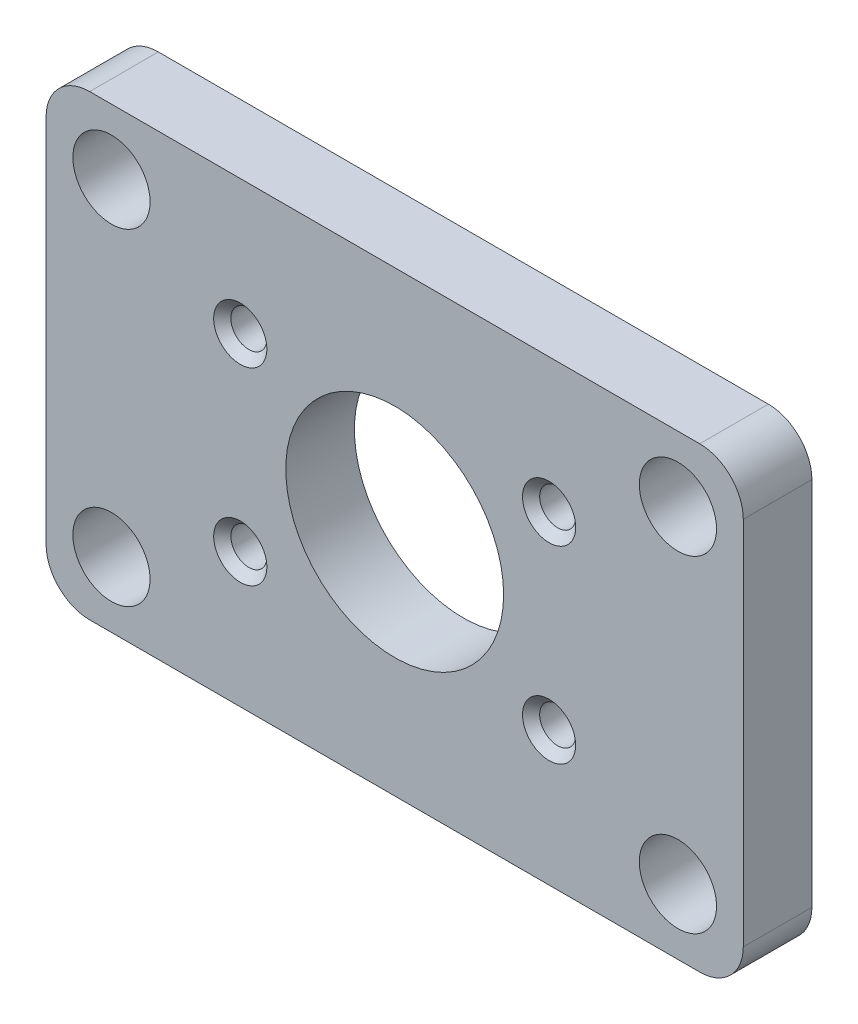
ISO-10303-21;
HEADER;
FILE_DESCRIPTION(('STEP AP214'),'2;1');
FILE_NAME('part.step','',(''),(''),'','','');
FILE_SCHEMA(('AUTOMOTIVE_DESIGN { 1 0 10303 214 1 1 1 1 }'));
ENDSEC;
DATA;
#1=APPLICATION_CONTEXT('core data for automotive mechanical design processes');
#2=APPLICATION_PROTOCOL_DEFINITION('international standard','automotive_design',2000,#1);
#3=PRODUCT_CONTEXT('',#1,'mechanical');
#4=PRODUCT('Part','Part','',(#3));
#5=PRODUCT_RELATED_PRODUCT_CATEGORY('part','',(#4));
#6=PRODUCT_DEFINITION_FORMATION('','',#4);
#7=PRODUCT_DEFINITION_CONTEXT('part definition',#1,'design');
#8=PRODUCT_DEFINITION('design','',#6,#7);
#9=PRODUCT_DEFINITION_SHAPE('','',#8);
#10=(LENGTH_UNIT() NAMED_UNIT(*) SI_UNIT(.MILLI.,.METRE.));
#11=(NAMED_UNIT(*) PLANE_ANGLE_UNIT() SI_UNIT($,.RADIAN.));
#12=(NAMED_UNIT(*) SI_UNIT($,.STERADIAN.) SOLID_ANGLE_UNIT());
#13=UNCERTAINTY_MEASURE_WITH_UNIT(LENGTH_MEASURE(1.E-05),#10,'distance_accuracy_value','');
#14=(GEOMETRIC_REPRESENTATION_CONTEXT(3) GLOBAL_UNCERTAINTY_ASSIGNED_CONTEXT((#13)) GLOBAL_UNIT_ASSIGNED_CONTEXT((#10,
#11,#12)) REPRESENTATION_CONTEXT('',''));
#15=CARTESIAN_POINT('',(0.,0.,0.));
#16=DIRECTION('',(0.,0.,1.));
#17=DIRECTION('',(1.,0.,0.));
#18=AXIS2_PLACEMENT_3D('',#15,#16,#17);
#19=CARTESIAN_POINT('',(0.,0.,4.));
#20=DIRECTION('',(0.,0.,1.));
#21=DIRECTION('',(1.,0.,0.));
#22=AXIS2_PLACEMENT_3D('',#19,#20,#21);
#23=PLANE('',#22);
#24=CARTESIAN_POINT('',(9.00048999999999,-5.50037,4.));
#25=DIRECTION('',(0.,0.,1.));
#26=DIRECTION('',(1.,0.,0.));
#27=AXIS2_PLACEMENT_3D('',#24,#25,#26);
#28=CIRCLE('',#27,1.55);
#29=CARTESIAN_POINT('',(10.55049,-5.50037,4.));
#30=VERTEX_POINT('',#29);
#31=EDGE_CURVE('E181',#30,#30,#28,.F.);
#32=ORIENTED_EDGE('',*,*,#31,.T.);
#33=EDGE_LOOP('',(#32));
#34=FACE_BOUND('',#33,.T.);
#35=CARTESIAN_POINT('',(9.00048999999999,5.50037,4.));
#36=DIRECTION('',(0.,0.,1.));
#37=DIRECTION('',(1.,0.,0.));
#38=AXIS2_PLACEMENT_3D('',#35,#36,#37);
#39=CIRCLE('',#38,1.55);
#40=CARTESIAN_POINT('',(10.55049,5.50037,4.));
#41=VERTEX_POINT('',#40);
#42=EDGE_CURVE('E178',#41,#41,#39,.F.);
#43=ORIENTED_EDGE('',*,*,#42,.T.);
#44=EDGE_LOOP('',(#43));
#45=FACE_BOUND('',#44,.T.);
#46=CARTESIAN_POINT('',(-9.00049,-5.50037000000001,4.));
#47=DIRECTION('',(0.,0.,1.));
#48=DIRECTION('',(1.,0.,0.));
#49=AXIS2_PLACEMENT_3D('',#46,#47,#48);
#50=CIRCLE('',#49,1.55);
#51=CARTESIAN_POINT('',(-7.45049,-5.50037000000001,4.));
#52=VERTEX_POINT('',#51);
#53=EDGE_CURVE('E175',#52,#52,#50,.F.);
#54=ORIENTED_EDGE('',*,*,#53,.T.);
#55=EDGE_LOOP('',(#54));
#56=FACE_BOUND('',#55,.T.);
#57=CARTESIAN_POINT('',(-9.00049,5.50037,4.));
#58=DIRECTION('',(0.,0.,1.));
#59=DIRECTION('',(1.,0.,0.));
#60=AXIS2_PLACEMENT_3D('',#57,#58,#59);
#61=CIRCLE('',#60,1.55);
#62=CARTESIAN_POINT('',(-7.45049,5.50037,4.));
#63=VERTEX_POINT('',#62);
#64=EDGE_CURVE('E172',#63,#63,#61,.F.);
#65=ORIENTED_EDGE('',*,*,#64,.T.);
#66=EDGE_LOOP('',(#65));
#67=FACE_BOUND('',#66,.T.);
#68=CARTESIAN_POINT('',(0.,0.,4.));
#69=DIRECTION('',(0.,0.,1.));
#70=DIRECTION('',(1.,0.,0.));
#71=AXIS2_PLACEMENT_3D('',#68,#69,#70);
#72=CIRCLE('',#71,6.34999999999999);
#73=CARTESIAN_POINT('',(6.35,0.,4.));
#74=VERTEX_POINT('',#73);
#75=EDGE_CURVE('E329',#74,#74,#72,.T.);
#76=ORIENTED_EDGE('',*,*,#75,.F.);
#77=EDGE_LOOP('',(#76));
#78=FACE_BOUND('',#77,.T.);
#79=CARTESIAN_POINT('',(16.51,-9.525,4.));
#80=DIRECTION('',(0.,0.,1.));
#81=DIRECTION('',(-1.,0.,0.));
#82=AXIS2_PLACEMENT_3D('',#79,#80,#81);
#83=CIRCLE('',#82,2.25);
#84=CARTESIAN_POINT('',(14.26,-9.525,4.));
#85=VERTEX_POINT('',#84);
#86=EDGE_CURVE('E276',#85,#85,#83,.T.);
#87=ORIENTED_EDGE('',*,*,#86,.F.);
#88=EDGE_LOOP('',(#87));
#89=FACE_BOUND('',#88,.T.);
#90=CARTESIAN_POINT('',(16.51,9.525,4.));
#91=DIRECTION('',(0.,0.,1.));
#92=DIRECTION('',(1.,0.,0.));
#93=AXIS2_PLACEMENT_3D('',#90,#91,#92);
#94=CIRCLE('',#93,2.25000000000001);
#95=CARTESIAN_POINT('',(18.76,9.525,4.));
#96=VERTEX_POINT('',#95);
#97=EDGE_CURVE('E279',#96,#96,#94,.T.);
#98=ORIENTED_EDGE('',*,*,#97,.F.);
#99=EDGE_LOOP('',(#98));
#100=FACE_BOUND('',#99,.T.);
#101=DIRECTION('',(0.,1.,0.));
#102=VECTOR('',#101,1.);
#103=CARTESIAN_POINT('',(20.32,-13.335,4.));
#104=LINE('',#103,#102);
#105=CARTESIAN_POINT('',(20.32,-10.795,4.));
#106=VERTEX_POINT('',#105);
#107=CARTESIAN_POINT('',(20.32,10.795,4.));
#108=VERTEX_POINT('',#107);
#109=EDGE_CURVE('E296',#106,#108,#104,.T.);
#110=ORIENTED_EDGE('',*,*,#109,.T.);
#111=CARTESIAN_POINT('',(17.78,10.795,4.));
#112=DIRECTION('',(0.,0.,1.));
#113=DIRECTION('',(1.,0.,0.));
#114=AXIS2_PLACEMENT_3D('',#111,#112,#113);
#115=CIRCLE('',#114,2.54);
#116=CARTESIAN_POINT('',(17.78,13.335,4.));
#117=VERTEX_POINT('',#116);
#118=EDGE_CURVE('E158',#108,#117,#115,.T.);
#119=ORIENTED_EDGE('',*,*,#118,.T.);
#120=DIRECTION('',(-1.,0.,0.));
#121=VECTOR('',#120,1.);
#122=CARTESIAN_POINT('',(20.32,13.335,4.));
#123=LINE('',#122,#121);
#124=CARTESIAN_POINT('',(-17.78,13.335,4.));
#125=VERTEX_POINT('',#124);
#126=EDGE_CURVE('E129',#117,#125,#123,.T.);
#127=ORIENTED_EDGE('',*,*,#126,.T.);
#128=CARTESIAN_POINT('',(-17.78,10.795,4.));
#129=DIRECTION('',(0.,0.,1.));
#130=DIRECTION('',(1.,0.,0.));
#131=AXIS2_PLACEMENT_3D('',#128,#129,#130);
#132=CIRCLE('',#131,2.54);
#133=CARTESIAN_POINT('',(-20.32,10.795,4.));
#134=VERTEX_POINT('',#133);
#135=EDGE_CURVE('E153',#125,#134,#132,.T.);
#136=ORIENTED_EDGE('',*,*,#135,.T.);
#137=DIRECTION('',(0.,-1.,0.));
#138=VECTOR('',#137,1.);
#139=CARTESIAN_POINT('',(-20.32,-13.335,4.));
#140=LINE('',#139,#138);
#141=CARTESIAN_POINT('',(-20.32,-10.795,4.));
#142=VERTEX_POINT('',#141);
#143=EDGE_CURVE('E136',#134,#142,#140,.T.);
#144=ORIENTED_EDGE('',*,*,#143,.T.);
#145=CARTESIAN_POINT('',(-17.78,-10.795,4.));
#146=DIRECTION('',(0.,0.,1.));
#147=DIRECTION('',(1.,0.,0.));
#148=AXIS2_PLACEMENT_3D('',#145,#146,#147);
#149=CIRCLE('',#148,2.54);
#150=CARTESIAN_POINT('',(-17.78,-13.335,4.));
#151=VERTEX_POINT('',#150);
#152=EDGE_CURVE('E64',#142,#151,#149,.T.);
#153=ORIENTED_EDGE('',*,*,#152,.T.);
#154=DIRECTION('',(1.,0.,0.));
#155=VECTOR('',#154,1.);
#156=CARTESIAN_POINT('',(20.32,-13.335,4.));
#157=LINE('',#156,#155);
#158=CARTESIAN_POINT('',(17.78,-13.335,4.));
#159=VERTEX_POINT('',#158);
#160=EDGE_CURVE('E139',#151,#159,#157,.T.);
#161=ORIENTED_EDGE('',*,*,#160,.T.);
#162=CARTESIAN_POINT('',(17.78,-10.795,4.));
#163=DIRECTION('',(0.,0.,1.));
#164=DIRECTION('',(1.,0.,0.));
#165=AXIS2_PLACEMENT_3D('',#162,#163,#164);
#166=CIRCLE('',#165,2.54);
#167=EDGE_CURVE('E156',#159,#106,#166,.T.);
#168=ORIENTED_EDGE('',*,*,#167,.T.);
#169=EDGE_LOOP('',(#110,#119,#127,#136,#144,#153,#161,#168));
#170=FACE_BOUND('',#169,.T.);
#171=CARTESIAN_POINT('',(-16.51,9.525,4.));
#172=DIRECTION('',(0.,0.,1.));
#173=DIRECTION('',(1.,0.,0.));
#174=AXIS2_PLACEMENT_3D('',#171,#172,#173);
#175=CIRCLE('',#174,2.25);
#176=CARTESIAN_POINT('',(-14.26,9.525,4.));
#177=VERTEX_POINT('',#176);
#178=EDGE_CURVE('E289',#177,#177,#175,.T.);
#179=ORIENTED_EDGE('',*,*,#178,.F.);
#180=EDGE_LOOP('',(#179));
#181=FACE_BOUND('',#180,.T.);
#182=CARTESIAN_POINT('',(-16.51,-9.525,4.));
#183=DIRECTION('',(0.,0.,1.));
#184=DIRECTION('',(-1.,0.,0.));
#185=AXIS2_PLACEMENT_3D('',#182,#183,#184);
#186=CIRCLE('',#185,2.25);
#187=CARTESIAN_POINT('',(-18.76,-9.525,4.));
#188=VERTEX_POINT('',#187);
#189=EDGE_CURVE('E315',#188,#188,#186,.T.);
#190=ORIENTED_EDGE('',*,*,#189,.F.);
#191=EDGE_LOOP('',(#190));
#192=FACE_BOUND('',#191,.T.);
#193=ADVANCED_FACE('F41',(#34,#45,#56,#67,#78,#89,#100,#170,#181,#192),#23,.T.);
#194=CARTESIAN_POINT('',(0.,0.,0.));
#195=DIRECTION('',(0.,0.,1.));
#196=DIRECTION('',(1.,0.,0.));
#197=AXIS2_PLACEMENT_3D('',#194,#195,#196);
#198=PLANE('',#197);
#199=DIRECTION('',(-1.,0.,0.));
#200=VECTOR('',#199,1.);
#201=CARTESIAN_POINT('',(20.32,13.335,0.));
#202=LINE('',#201,#200);
#203=CARTESIAN_POINT('',(17.78,13.335,0.));
#204=VERTEX_POINT('',#203);
#205=CARTESIAN_POINT('',(-17.78,13.335,0.));
#206=VERTEX_POINT('',#205);
#207=EDGE_CURVE('E126',#204,#206,#202,.T.);
#208=ORIENTED_EDGE('',*,*,#207,.F.);
#209=CARTESIAN_POINT('',(17.78,10.795,0.));
#210=DIRECTION('',(0.,0.,1.));
#211=DIRECTION('',(1.,0.,0.));
#212=AXIS2_PLACEMENT_3D('',#209,#210,#211);
#213=CIRCLE('',#212,2.54);
#214=CARTESIAN_POINT('',(20.32,10.795,0.));
#215=VERTEX_POINT('',#214);
#216=EDGE_CURVE('E109',#204,#215,#213,.F.);
#217=ORIENTED_EDGE('',*,*,#216,.T.);
#218=DIRECTION('',(0.,1.,0.));
#219=VECTOR('',#218,1.);
#220=CARTESIAN_POINT('',(20.32,-13.335,0.));
#221=LINE('',#220,#219);
#222=CARTESIAN_POINT('',(20.32,-10.795,0.));
#223=VERTEX_POINT('',#222);
#224=EDGE_CURVE('E137',#223,#215,#221,.T.);
#225=ORIENTED_EDGE('',*,*,#224,.F.);
#226=CARTESIAN_POINT('',(17.78,-10.795,0.));
#227=DIRECTION('',(0.,0.,1.));
#228=DIRECTION('',(1.,0.,0.));
#229=AXIS2_PLACEMENT_3D('',#226,#227,#228);
#230=CIRCLE('',#229,2.54);
#231=CARTESIAN_POINT('',(17.78,-13.335,0.));
#232=VERTEX_POINT('',#231);
#233=EDGE_CURVE('E120',#223,#232,#230,.F.);
#234=ORIENTED_EDGE('',*,*,#233,.T.);
#235=DIRECTION('',(1.,0.,0.));
#236=VECTOR('',#235,1.);
#237=CARTESIAN_POINT('',(20.32,-13.335,0.));
#238=LINE('',#237,#236);
#239=CARTESIAN_POINT('',(-17.78,-13.335,0.));
#240=VERTEX_POINT('',#239);
#241=EDGE_CURVE('E141',#240,#232,#238,.T.);
#242=ORIENTED_EDGE('',*,*,#241,.F.);
#243=CARTESIAN_POINT('',(-17.78,-10.795,0.));
#244=DIRECTION('',(0.,0.,1.));
#245=DIRECTION('',(1.,0.,0.));
#246=AXIS2_PLACEMENT_3D('',#243,#244,#245);
#247=CIRCLE('',#246,2.54);
#248=CARTESIAN_POINT('',(-20.32,-10.795,0.));
#249=VERTEX_POINT('',#248);
#250=EDGE_CURVE('E147',#240,#249,#247,.F.);
#251=ORIENTED_EDGE('',*,*,#250,.T.);
#252=DIRECTION('',(0.,-1.,0.));
#253=VECTOR('',#252,1.);
#254=CARTESIAN_POINT('',(-20.32,-13.335,0.));
#255=LINE('',#254,#253);
#256=CARTESIAN_POINT('',(-20.32,10.795,0.));
#257=VERTEX_POINT('',#256);
#258=EDGE_CURVE('E292',#257,#249,#255,.T.);
#259=ORIENTED_EDGE('',*,*,#258,.F.);
#260=CARTESIAN_POINT('',(-17.78,10.795,0.));
#261=DIRECTION('',(0.,0.,1.));
#262=DIRECTION('',(1.,0.,0.));
#263=AXIS2_PLACEMENT_3D('',#260,#261,#262);
#264=CIRCLE('',#263,2.54);
#265=EDGE_CURVE('E130',#257,#206,#264,.F.);
#266=ORIENTED_EDGE('',*,*,#265,.T.);
#267=EDGE_LOOP('',(#208,#217,#225,#234,#242,#251,#259,#266));
#268=FACE_BOUND('',#267,.T.);
#269=CARTESIAN_POINT('',(-16.51,9.525,0.));
#270=DIRECTION('',(0.,0.,1.));
#271=DIRECTION('',(1.,0.,0.));
#272=AXIS2_PLACEMENT_3D('',#269,#270,#271);
#273=CIRCLE('',#272,2.25);
#274=CARTESIAN_POINT('',(-14.26,9.525,0.));
#275=VERTEX_POINT('',#274);
#276=EDGE_CURVE('E287',#275,#275,#273,.T.);
#277=ORIENTED_EDGE('',*,*,#276,.T.);
#278=EDGE_LOOP('',(#277));
#279=FACE_BOUND('',#278,.T.);
#280=CARTESIAN_POINT('',(16.51,9.525,0.));
#281=DIRECTION('',(0.,0.,1.));
#282=DIRECTION('',(1.,0.,0.));
#283=AXIS2_PLACEMENT_3D('',#280,#281,#282);
#284=CIRCLE('',#283,2.25000000000001);
#285=CARTESIAN_POINT('',(18.76,9.525,0.));
#286=VERTEX_POINT('',#285);
#287=EDGE_CURVE('E275',#286,#286,#284,.T.);
#288=ORIENTED_EDGE('',*,*,#287,.T.);
#289=EDGE_LOOP('',(#288));
#290=FACE_BOUND('',#289,.T.);
#291=CARTESIAN_POINT('',(9.00048999999999,-5.50037,0.));
#292=DIRECTION('',(0.,0.,1.));
#293=DIRECTION('',(1.,0.,0.));
#294=AXIS2_PLACEMENT_3D('',#291,#292,#293);
#295=CIRCLE('',#294,1.05);
#296=CARTESIAN_POINT('',(10.05049,-5.50037,0.));
#297=VERTEX_POINT('',#296);
#298=EDGE_CURVE('E273',#297,#297,#295,.T.);
#299=ORIENTED_EDGE('',*,*,#298,.T.);
#300=EDGE_LOOP('',(#299));
#301=FACE_BOUND('',#300,.T.);
#302=CARTESIAN_POINT('',(16.51,-9.525,0.));
#303=DIRECTION('',(0.,0.,1.));
#304=DIRECTION('',(-1.,0.,0.));
#305=AXIS2_PLACEMENT_3D('',#302,#303,#304);
#306=CIRCLE('',#305,2.25);
#307=CARTESIAN_POINT('',(14.26,-9.525,0.));
#308=VERTEX_POINT('',#307);
#309=EDGE_CURVE('E282',#308,#308,#306,.T.);
#310=ORIENTED_EDGE('',*,*,#309,.T.);
#311=EDGE_LOOP('',(#310));
#312=FACE_BOUND('',#311,.T.);
#313=CARTESIAN_POINT('',(-16.51,-9.525,0.));
#314=DIRECTION('',(0.,0.,1.));
#315=DIRECTION('',(-1.,0.,0.));
#316=AXIS2_PLACEMENT_3D('',#313,#314,#315);
#317=CIRCLE('',#316,2.25);
#318=CARTESIAN_POINT('',(-18.76,-9.525,0.));
#319=VERTEX_POINT('',#318);
#320=EDGE_CURVE('E317',#319,#319,#317,.T.);
#321=ORIENTED_EDGE('',*,*,#320,.T.);
#322=EDGE_LOOP('',(#321));
#323=FACE_BOUND('',#322,.T.);
#324=CARTESIAN_POINT('',(-9.00049,5.50037,0.));
#325=DIRECTION('',(0.,0.,1.));
#326=DIRECTION('',(1.,0.,0.));
#327=AXIS2_PLACEMENT_3D('',#324,#325,#326);
#328=CIRCLE('',#327,1.05);
#329=CARTESIAN_POINT('',(-7.95049,5.50037,0.));
#330=VERTEX_POINT('',#329);
#331=EDGE_CURVE('E321',#330,#330,#328,.T.);
#332=ORIENTED_EDGE('',*,*,#331,.T.);
#333=EDGE_LOOP('',(#332));
#334=FACE_BOUND('',#333,.T.);
#335=CARTESIAN_POINT('',(-9.00049,-5.50037000000001,0.));
#336=DIRECTION('',(0.,0.,1.));
#337=DIRECTION('',(-1.,0.,0.));
#338=AXIS2_PLACEMENT_3D('',#335,#336,#337);
#339=CIRCLE('',#338,1.05);
#340=CARTESIAN_POINT('',(-10.05049,-5.50037000000001,0.));
#341=VERTEX_POINT('',#340);
#342=EDGE_CURVE('E326',#341,#341,#339,.T.);
#343=ORIENTED_EDGE('',*,*,#342,.T.);
#344=EDGE_LOOP('',(#343));
#345=FACE_BOUND('',#344,.T.);
#346=CARTESIAN_POINT('',(0.,0.,0.));
#347=DIRECTION('',(0.,0.,1.));
#348=DIRECTION('',(1.,0.,0.));
#349=AXIS2_PLACEMENT_3D('',#346,#347,#348);
#350=CIRCLE('',#349,6.34999999999999);
#351=CARTESIAN_POINT('',(6.35,0.,0.));
#352=VERTEX_POINT('',#351);
#353=EDGE_CURVE('E330',#352,#352,#350,.T.);
#354=ORIENTED_EDGE('',*,*,#353,.T.);
#355=EDGE_LOOP('',(#354));
#356=FACE_BOUND('',#355,.T.);
#357=CARTESIAN_POINT('',(9.00048999999999,5.50037,0.));
#358=DIRECTION('',(0.,0.,1.));
#359=DIRECTION('',(-1.,0.,0.));
#360=AXIS2_PLACEMENT_3D('',#357,#358,#359);
#361=CIRCLE('',#360,1.04999999999999);
#362=CARTESIAN_POINT('',(7.95049000000001,5.50037,0.));
#363=VERTEX_POINT('',#362);
#364=EDGE_CURVE('E333',#363,#363,#361,.T.);
#365=ORIENTED_EDGE('',*,*,#364,.T.);
#366=EDGE_LOOP('',(#365));
#367=FACE_BOUND('',#366,.T.);
#368=ADVANCED_FACE('F133',(#268,#279,#290,#301,#312,#323,#334,#345,#356,#367),#198,.F.);
#369=CARTESIAN_POINT('',(-20.32,-13.335,4.));
#370=DIRECTION('',(1.,0.,0.));
#371=DIRECTION('',(0.,0.,-1.));
#372=AXIS2_PLACEMENT_3D('',#369,#370,#371);
#373=PLANE('',#372);
#374=ORIENTED_EDGE('',*,*,#258,.T.);
#375=DIRECTION('',(0.,0.,-1.));
#376=VECTOR('',#375,1.);
#377=CARTESIAN_POINT('',(-20.32,-10.795,4.));
#378=LINE('',#377,#376);
#379=EDGE_CURVE('E167',#249,#142,#378,.F.);
#380=ORIENTED_EDGE('',*,*,#379,.T.);
#381=ORIENTED_EDGE('',*,*,#143,.F.);
#382=DIRECTION('',(0.,0.,-1.));
#383=VECTOR('',#382,1.);
#384=CARTESIAN_POINT('',(-20.32,10.795,4.));
#385=LINE('',#384,#383);
#386=EDGE_CURVE('E164',#134,#257,#385,.T.);
#387=ORIENTED_EDGE('',*,*,#386,.T.);
#388=EDGE_LOOP('',(#374,#380,#381,#387));
#389=FACE_BOUND('',#388,.T.);
#390=ADVANCED_FACE('F214',(#389),#373,.F.);
#391=CARTESIAN_POINT('',(20.32,-13.335,4.));
#392=DIRECTION('',(0.,1.,0.));
#393=DIRECTION('',(-1.,0.,0.));
#394=AXIS2_PLACEMENT_3D('',#391,#392,#393);
#395=PLANE('',#394);
#396=ORIENTED_EDGE('',*,*,#241,.T.);
#397=DIRECTION('',(0.,0.,-1.));
#398=VECTOR('',#397,1.);
#399=CARTESIAN_POINT('',(17.78,-13.335,4.));
#400=LINE('',#399,#398);
#401=EDGE_CURVE('E57',#232,#159,#400,.F.);
#402=ORIENTED_EDGE('',*,*,#401,.T.);
#403=ORIENTED_EDGE('',*,*,#160,.F.);
#404=DIRECTION('',(0.,0.,-1.));
#405=VECTOR('',#404,1.);
#406=CARTESIAN_POINT('',(-17.78,-13.335,4.));
#407=LINE('',#406,#405);
#408=EDGE_CURVE('E160',#151,#240,#407,.T.);
#409=ORIENTED_EDGE('',*,*,#408,.T.);
#410=EDGE_LOOP('',(#396,#402,#403,#409));
#411=FACE_BOUND('',#410,.T.);
#412=ADVANCED_FACE('F226',(#411),#395,.F.);
#413=CARTESIAN_POINT('',(20.32,-13.335,4.));
#414=DIRECTION('',(-1.,0.,0.));
#415=DIRECTION('',(0.,0.,1.));
#416=AXIS2_PLACEMENT_3D('',#413,#414,#415);
#417=PLANE('',#416);
#418=ORIENTED_EDGE('',*,*,#224,.T.);
#419=DIRECTION('',(0.,0.,-1.));
#420=VECTOR('',#419,1.);
#421=CARTESIAN_POINT('',(20.32,10.795,4.));
#422=LINE('',#421,#420);
#423=EDGE_CURVE('E114',#215,#108,#422,.F.);
#424=ORIENTED_EDGE('',*,*,#423,.T.);
#425=ORIENTED_EDGE('',*,*,#109,.F.);
#426=DIRECTION('',(0.,0.,-1.));
#427=VECTOR('',#426,1.);
#428=CARTESIAN_POINT('',(20.32,-10.795,4.));
#429=LINE('',#428,#427);
#430=EDGE_CURVE('E119',#106,#223,#429,.T.);
#431=ORIENTED_EDGE('',*,*,#430,.T.);
#432=EDGE_LOOP('',(#418,#424,#425,#431));
#433=FACE_BOUND('',#432,.T.);
#434=ADVANCED_FACE('F223',(#433),#417,.F.);
#435=CARTESIAN_POINT('',(20.32,13.335,4.));
#436=DIRECTION('',(0.,-1.,0.));
#437=DIRECTION('',(1.,0.,0.));
#438=AXIS2_PLACEMENT_3D('',#435,#436,#437);
#439=PLANE('',#438);
#440=ORIENTED_EDGE('',*,*,#126,.F.);
#441=DIRECTION('',(0.,0.,-1.));
#442=VECTOR('',#441,1.);
#443=CARTESIAN_POINT('',(17.78,13.335,4.));
#444=LINE('',#443,#442);
#445=EDGE_CURVE('E113',#117,#204,#444,.T.);
#446=ORIENTED_EDGE('',*,*,#445,.T.);
#447=ORIENTED_EDGE('',*,*,#207,.T.);
#448=DIRECTION('',(0.,0.,-1.));
#449=VECTOR('',#448,1.);
#450=CARTESIAN_POINT('',(-17.78,13.335,4.));
#451=LINE('',#450,#449);
#452=EDGE_CURVE('E131',#206,#125,#451,.F.);
#453=ORIENTED_EDGE('',*,*,#452,.T.);
#454=EDGE_LOOP('',(#440,#446,#447,#453));
#455=FACE_BOUND('',#454,.T.);
#456=ADVANCED_FACE('F125',(#455),#439,.F.);
#457=CARTESIAN_POINT('',(-16.51,9.525,4.));
#458=DIRECTION('',(0.,0.,-1.));
#459=DIRECTION('',(-1.,0.,0.));
#460=AXIS2_PLACEMENT_3D('',#457,#458,#459);
#461=CYLINDRICAL_SURFACE('',#460,2.25);
#462=ORIENTED_EDGE('',*,*,#178,.T.);
#463=EDGE_LOOP('',(#462));
#464=FACE_BOUND('',#463,.T.);
#465=ORIENTED_EDGE('',*,*,#276,.F.);
#466=EDGE_LOOP('',(#465));
#467=FACE_BOUND('',#466,.T.);
#468=ADVANCED_FACE('F218',(#464,#467),#461,.F.);
#469=CARTESIAN_POINT('',(16.51,9.525,4.));
#470=DIRECTION('',(0.,0.,-1.));
#471=DIRECTION('',(-1.,0.,0.));
#472=AXIS2_PLACEMENT_3D('',#469,#470,#471);
#473=CYLINDRICAL_SURFACE('',#472,2.25000000000001);
#474=ORIENTED_EDGE('',*,*,#97,.T.);
#475=EDGE_LOOP('',(#474));
#476=FACE_BOUND('',#475,.T.);
#477=ORIENTED_EDGE('',*,*,#287,.F.);
#478=EDGE_LOOP('',(#477));
#479=FACE_BOUND('',#478,.T.);
#480=ADVANCED_FACE('F269',(#476,#479),#473,.F.);
#481=CARTESIAN_POINT('',(9.00048999999999,-5.50037,4.));
#482=DIRECTION('',(0.,0.,-1.));
#483=DIRECTION('',(-1.,0.,0.));
#484=AXIS2_PLACEMENT_3D('',#481,#482,#483);
#485=CYLINDRICAL_SURFACE('',#484,1.05);
#486=CARTESIAN_POINT('',(9.00048999999999,-5.50037,3.5));
#487=DIRECTION('',(0.,0.,1.));
#488=DIRECTION('',(1.,0.,0.));
#489=AXIS2_PLACEMENT_3D('',#486,#487,#488);
#490=CIRCLE('',#489,1.05);
#491=CARTESIAN_POINT('',(10.05049,-5.50037,3.5));
#492=VERTEX_POINT('',#491);
#493=EDGE_CURVE('E169',#492,#492,#490,.T.);
#494=ORIENTED_EDGE('',*,*,#493,.T.);
#495=EDGE_LOOP('',(#494));
#496=FACE_BOUND('',#495,.T.);
#497=ORIENTED_EDGE('',*,*,#298,.F.);
#498=EDGE_LOOP('',(#497));
#499=FACE_BOUND('',#498,.T.);
#500=ADVANCED_FACE('F266',(#496,#499),#485,.F.);
#501=CARTESIAN_POINT('',(16.51,-9.525,4.));
#502=DIRECTION('',(0.,0.,-1.));
#503=DIRECTION('',(-1.,0.,0.));
#504=AXIS2_PLACEMENT_3D('',#501,#502,#503);
#505=CYLINDRICAL_SURFACE('',#504,2.25);
#506=ORIENTED_EDGE('',*,*,#86,.T.);
#507=EDGE_LOOP('',(#506));
#508=FACE_BOUND('',#507,.T.);
#509=ORIENTED_EDGE('',*,*,#309,.F.);
#510=EDGE_LOOP('',(#509));
#511=FACE_BOUND('',#510,.T.);
#512=ADVANCED_FACE('F268',(#508,#511),#505,.F.);
#513=CARTESIAN_POINT('',(-16.51,-9.525,4.));
#514=DIRECTION('',(0.,0.,-1.));
#515=DIRECTION('',(-1.,0.,0.));
#516=AXIS2_PLACEMENT_3D('',#513,#514,#515);
#517=CYLINDRICAL_SURFACE('',#516,2.25);
#518=ORIENTED_EDGE('',*,*,#189,.T.);
#519=EDGE_LOOP('',(#518));
#520=FACE_BOUND('',#519,.T.);
#521=ORIENTED_EDGE('',*,*,#320,.F.);
#522=EDGE_LOOP('',(#521));
#523=FACE_BOUND('',#522,.T.);
#524=ADVANCED_FACE('F354',(#520,#523),#517,.F.);
#525=CARTESIAN_POINT('',(-9.00049,5.50037,4.));
#526=DIRECTION('',(0.,0.,-1.));
#527=DIRECTION('',(-1.,0.,0.));
#528=AXIS2_PLACEMENT_3D('',#525,#526,#527);
#529=CYLINDRICAL_SURFACE('',#528,1.05);
#530=CARTESIAN_POINT('',(-9.00049,5.50037,3.5));
#531=DIRECTION('',(0.,0.,1.));
#532=DIRECTION('',(1.,0.,0.));
#533=AXIS2_PLACEMENT_3D('',#530,#531,#532);
#534=CIRCLE('',#533,1.05);
#535=CARTESIAN_POINT('',(-7.95049,5.50037,3.5));
#536=VERTEX_POINT('',#535);
#537=EDGE_CURVE('E11',#536,#536,#534,.T.);
#538=ORIENTED_EDGE('',*,*,#537,.T.);
#539=EDGE_LOOP('',(#538));
#540=FACE_BOUND('',#539,.T.);
#541=ORIENTED_EDGE('',*,*,#331,.F.);
#542=EDGE_LOOP('',(#541));
#543=FACE_BOUND('',#542,.T.);
#544=ADVANCED_FACE('F351',(#540,#543),#529,.F.);
#545=CARTESIAN_POINT('',(-9.00049,-5.50037000000001,4.));
#546=DIRECTION('',(0.,0.,-1.));
#547=DIRECTION('',(-1.,0.,0.));
#548=AXIS2_PLACEMENT_3D('',#545,#546,#547);
#549=CYLINDRICAL_SURFACE('',#548,1.05);
#550=CARTESIAN_POINT('',(-9.00049,-5.50037000000001,3.5));
#551=DIRECTION('',(0.,0.,1.));
#552=DIRECTION('',(1.,0.,0.));
#553=AXIS2_PLACEMENT_3D('',#550,#551,#552);
#554=CIRCLE('',#553,1.05);
#555=CARTESIAN_POINT('',(-7.95049,-5.50037000000001,3.5));
#556=VERTEX_POINT('',#555);
#557=EDGE_CURVE('E50',#556,#556,#554,.T.);
#558=ORIENTED_EDGE('',*,*,#557,.T.);
#559=EDGE_LOOP('',(#558));
#560=FACE_BOUND('',#559,.T.);
#561=ORIENTED_EDGE('',*,*,#342,.F.);
#562=EDGE_LOOP('',(#561));
#563=FACE_BOUND('',#562,.T.);
#564=ADVANCED_FACE('F189',(#560,#563),#549,.F.);
#565=CARTESIAN_POINT('',(0.,0.,4.));
#566=DIRECTION('',(0.,0.,-1.));
#567=DIRECTION('',(-1.,0.,0.));
#568=AXIS2_PLACEMENT_3D('',#565,#566,#567);
#569=CYLINDRICAL_SURFACE('',#568,6.34999999999999);
#570=ORIENTED_EDGE('',*,*,#75,.T.);
#571=EDGE_LOOP('',(#570));
#572=FACE_BOUND('',#571,.T.);
#573=ORIENTED_EDGE('',*,*,#353,.F.);
#574=EDGE_LOOP('',(#573));
#575=FACE_BOUND('',#574,.T.);
#576=ADVANCED_FACE('F340',(#572,#575),#569,.F.);
#577=CARTESIAN_POINT('',(9.00048999999999,5.50037,4.));
#578=DIRECTION('',(0.,0.,-1.));
#579=DIRECTION('',(-1.,0.,0.));
#580=AXIS2_PLACEMENT_3D('',#577,#578,#579);
#581=CYLINDRICAL_SURFACE('',#580,1.04999999999999);
#582=CARTESIAN_POINT('',(9.00048999999999,5.50037,3.49999999999999));
#583=DIRECTION('',(0.,0.,1.));
#584=DIRECTION('',(1.,0.,0.));
#585=AXIS2_PLACEMENT_3D('',#582,#583,#584);
#586=CIRCLE('',#585,1.04999999999999);
#587=CARTESIAN_POINT('',(10.05049,5.50037,3.49999999999999));
#588=VERTEX_POINT('',#587);
#589=EDGE_CURVE('E184',#588,#588,#586,.T.);
#590=ORIENTED_EDGE('',*,*,#589,.T.);
#591=EDGE_LOOP('',(#590));
#592=FACE_BOUND('',#591,.T.);
#593=ORIENTED_EDGE('',*,*,#364,.F.);
#594=EDGE_LOOP('',(#593));
#595=FACE_BOUND('',#594,.T.);
#596=ADVANCED_FACE('F236',(#592,#595),#581,.F.);
#597=CARTESIAN_POINT('',(17.78,10.795,4.));
#598=DIRECTION('',(0.,0.,-1.));
#599=DIRECTION('',(-1.,0.,0.));
#600=AXIS2_PLACEMENT_3D('',#597,#598,#599);
#601=CYLINDRICAL_SURFACE('',#600,2.54);
#602=ORIENTED_EDGE('',*,*,#118,.F.);
#603=ORIENTED_EDGE('',*,*,#423,.F.);
#604=ORIENTED_EDGE('',*,*,#216,.F.);
#605=ORIENTED_EDGE('',*,*,#445,.F.);
#606=EDGE_LOOP('',(#602,#603,#604,#605));
#607=FACE_BOUND('',#606,.T.);
#608=ADVANCED_FACE('F112',(#607),#601,.T.);
#609=CARTESIAN_POINT('',(17.78,-10.795,4.));
#610=DIRECTION('',(0.,0.,-1.));
#611=DIRECTION('',(-1.,0.,0.));
#612=AXIS2_PLACEMENT_3D('',#609,#610,#611);
#613=CYLINDRICAL_SURFACE('',#612,2.54);
#614=ORIENTED_EDGE('',*,*,#167,.F.);
#615=ORIENTED_EDGE('',*,*,#401,.F.);
#616=ORIENTED_EDGE('',*,*,#233,.F.);
#617=ORIENTED_EDGE('',*,*,#430,.F.);
#618=EDGE_LOOP('',(#614,#615,#616,#617));
#619=FACE_BOUND('',#618,.T.);
#620=ADVANCED_FACE('F235',(#619),#613,.T.);
#621=CARTESIAN_POINT('',(-17.78,-10.795,4.));
#622=DIRECTION('',(0.,0.,-1.));
#623=DIRECTION('',(-1.,0.,0.));
#624=AXIS2_PLACEMENT_3D('',#621,#622,#623);
#625=CYLINDRICAL_SURFACE('',#624,2.54);
#626=ORIENTED_EDGE('',*,*,#152,.F.);
#627=ORIENTED_EDGE('',*,*,#379,.F.);
#628=ORIENTED_EDGE('',*,*,#250,.F.);
#629=ORIENTED_EDGE('',*,*,#408,.F.);
#630=EDGE_LOOP('',(#626,#627,#628,#629));
#631=FACE_BOUND('',#630,.T.);
#632=ADVANCED_FACE('F239',(#631),#625,.T.);
#633=CARTESIAN_POINT('',(-17.78,10.795,4.));
#634=DIRECTION('',(0.,0.,-1.));
#635=DIRECTION('',(-1.,0.,0.));
#636=AXIS2_PLACEMENT_3D('',#633,#634,#635);
#637=CYLINDRICAL_SURFACE('',#636,2.54);
#638=ORIENTED_EDGE('',*,*,#135,.F.);
#639=ORIENTED_EDGE('',*,*,#452,.F.);
#640=ORIENTED_EDGE('',*,*,#265,.F.);
#641=ORIENTED_EDGE('',*,*,#386,.F.);
#642=EDGE_LOOP('',(#638,#639,#640,#641));
#643=FACE_BOUND('',#642,.T.);
#644=ADVANCED_FACE('F243',(#643),#637,.T.);
#645=CARTESIAN_POINT('',(9.00048999999999,-5.50037,3.5));
#646=DIRECTION('',(0.,0.,1.));
#647=DIRECTION('',(1.,0.,0.));
#648=AXIS2_PLACEMENT_3D('',#645,#646,#647);
#649=CONICAL_SURFACE('',#648,1.05,0.785398163397452);
#650=ORIENTED_EDGE('',*,*,#31,.F.);
#651=EDGE_LOOP('',(#650));
#652=FACE_BOUND('',#651,.T.);
#653=ORIENTED_EDGE('',*,*,#493,.F.);
#654=EDGE_LOOP('',(#653));
#655=FACE_BOUND('',#654,.T.);
#656=ADVANCED_FACE('F201',(#652,#655),#649,.F.);
#657=CARTESIAN_POINT('',(9.00048999999999,5.50037,3.49999999999999));
#658=DIRECTION('',(0.,0.,1.));
#659=DIRECTION('',(1.,0.,0.));
#660=AXIS2_PLACEMENT_3D('',#657,#658,#659);
#661=CONICAL_SURFACE('',#660,1.04999999999999,0.785398163397452);
#662=ORIENTED_EDGE('',*,*,#42,.F.);
#663=EDGE_LOOP('',(#662));
#664=FACE_BOUND('',#663,.T.);
#665=ORIENTED_EDGE('',*,*,#589,.F.);
#666=EDGE_LOOP('',(#665));
#667=FACE_BOUND('',#666,.T.);
#668=ADVANCED_FACE('F194',(#664,#667),#661,.F.);
#669=CARTESIAN_POINT('',(-9.00049,-5.50037000000001,3.5));
#670=DIRECTION('',(0.,0.,1.));
#671=DIRECTION('',(1.,0.,0.));
#672=AXIS2_PLACEMENT_3D('',#669,#670,#671);
#673=CONICAL_SURFACE('',#672,1.05,0.785398163397452);
#674=ORIENTED_EDGE('',*,*,#53,.F.);
#675=EDGE_LOOP('',(#674));
#676=FACE_BOUND('',#675,.T.);
#677=ORIENTED_EDGE('',*,*,#557,.F.);
#678=EDGE_LOOP('',(#677));
#679=FACE_BOUND('',#678,.T.);
#680=ADVANCED_FACE('F192',(#676,#679),#673,.F.);
#681=CARTESIAN_POINT('',(-9.00049,5.50037,3.5));
#682=DIRECTION('',(0.,0.,1.));
#683=DIRECTION('',(1.,0.,0.));
#684=AXIS2_PLACEMENT_3D('',#681,#682,#683);
#685=CONICAL_SURFACE('',#684,1.05,0.785398163397452);
#686=ORIENTED_EDGE('',*,*,#64,.F.);
#687=EDGE_LOOP('',(#686));
#688=FACE_BOUND('',#687,.T.);
#689=ORIENTED_EDGE('',*,*,#537,.F.);
#690=EDGE_LOOP('',(#689));
#691=FACE_BOUND('',#690,.T.);
#692=ADVANCED_FACE('F44',(#688,#691),#685,.F.);
#693=CLOSED_SHELL('',(#193,#368,#390,#412,#434,#456,#468,#480,#500,#512,#524,#544,#564,#576,
#596,#608,#620,#632,#644,#656,#668,#680,#692));
#694=MANIFOLD_SOLID_BREP('B2',#693);
#695=ADVANCED_BREP_SHAPE_REPRESENTATION('',(#18,#694),#14);
#696=SHAPE_DEFINITION_REPRESENTATION(#9,#695);
ENDSEC;
END-ISO-10303-21;
